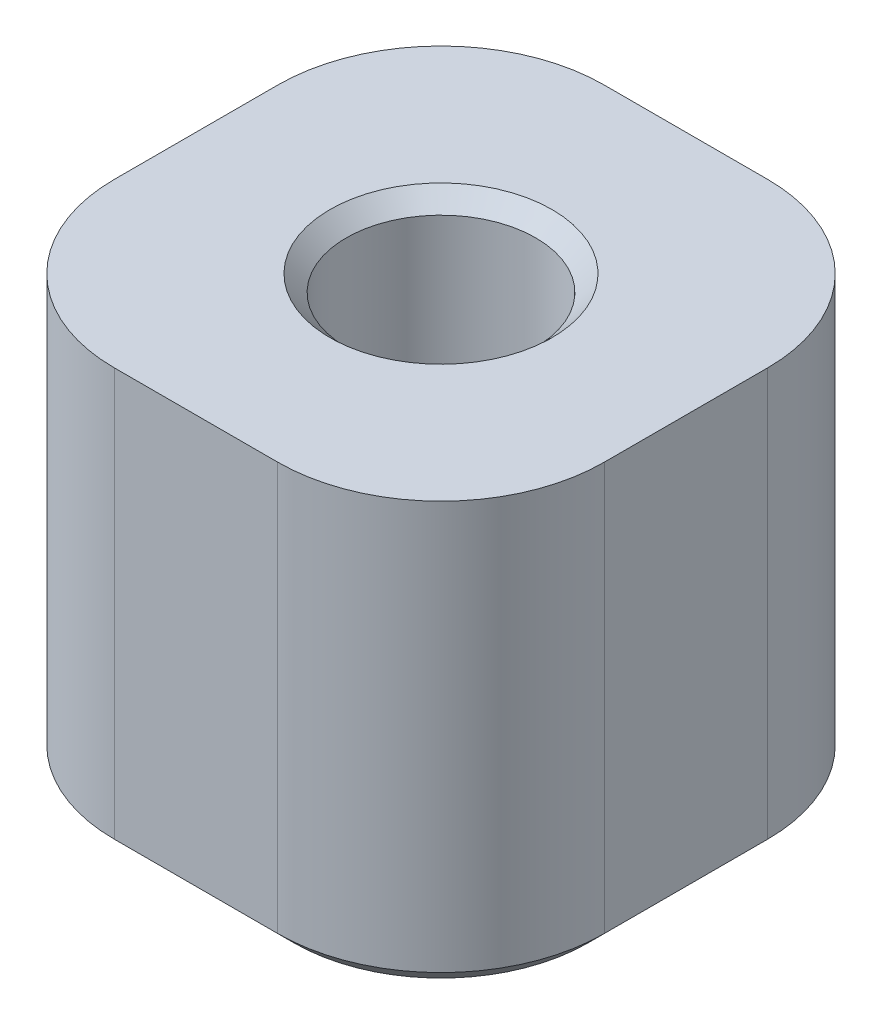
ISO-10303-21;
HEADER;
FILE_DESCRIPTION(('STEP AP214'),'2;1');
FILE_NAME('part.step','',(''),(''),'','','');
FILE_SCHEMA(('AUTOMOTIVE_DESIGN { 1 0 10303 214 1 1 1 1 }'));
ENDSEC;
DATA;
#1=APPLICATION_CONTEXT('core data for automotive mechanical design processes');
#2=APPLICATION_PROTOCOL_DEFINITION('international standard','automotive_design',2000,#1);
#3=PRODUCT_CONTEXT('',#1,'mechanical');
#4=PRODUCT('Part','Part','',(#3));
#5=PRODUCT_RELATED_PRODUCT_CATEGORY('part','',(#4));
#6=PRODUCT_DEFINITION_FORMATION('','',#4);
#7=PRODUCT_DEFINITION_CONTEXT('part definition',#1,'design');
#8=PRODUCT_DEFINITION('design','',#6,#7);
#9=PRODUCT_DEFINITION_SHAPE('','',#8);
#10=(LENGTH_UNIT() NAMED_UNIT(*) SI_UNIT(.MILLI.,.METRE.));
#11=(NAMED_UNIT(*) PLANE_ANGLE_UNIT() SI_UNIT($,.RADIAN.));
#12=(NAMED_UNIT(*) SI_UNIT($,.STERADIAN.) SOLID_ANGLE_UNIT());
#13=UNCERTAINTY_MEASURE_WITH_UNIT(LENGTH_MEASURE(1.E-05),#10,'distance_accuracy_value','');
#14=(GEOMETRIC_REPRESENTATION_CONTEXT(3) GLOBAL_UNCERTAINTY_ASSIGNED_CONTEXT((#13)) GLOBAL_UNIT_ASSIGNED_CONTEXT((#10,
#11,#12)) REPRESENTATION_CONTEXT('',''));
#15=CARTESIAN_POINT('',(0.,0.,0.));
#16=DIRECTION('',(0.,0.,1.));
#17=DIRECTION('',(1.,0.,0.));
#18=AXIS2_PLACEMENT_3D('',#15,#16,#17);
#19=CARTESIAN_POINT('',(15.,26.,15.));
#20=DIRECTION('',(-1.,0.,0.));
#21=DIRECTION('',(0.,0.,1.));
#22=AXIS2_PLACEMENT_3D('',#19,#20,#21);
#23=PLANE('',#22);
#24=DIRECTION('',(0.,-1.,0.));
#25=VECTOR('',#24,1.);
#26=CARTESIAN_POINT('',(15.,26.,5.));
#27=LINE('',#26,#25);
#28=CARTESIAN_POINT('',(15.,26.,5.));
#29=VERTEX_POINT('',#28);
#30=CARTESIAN_POINT('',(15.,1.,5.));
#31=VERTEX_POINT('',#30);
#32=EDGE_CURVE('E143',#29,#31,#27,.T.);
#33=ORIENTED_EDGE('',*,*,#32,.T.);
#34=DIRECTION('',(0.,0.,-1.));
#35=VECTOR('',#34,1.);
#36=CARTESIAN_POINT('',(15.,1.,-5.));
#37=LINE('',#36,#35);
#38=CARTESIAN_POINT('',(15.,1.,-5.));
#39=VERTEX_POINT('',#38);
#40=EDGE_CURVE('E224',#31,#39,#37,.T.);
#41=ORIENTED_EDGE('',*,*,#40,.T.);
#42=DIRECTION('',(0.,-1.,0.));
#43=VECTOR('',#42,1.);
#44=CARTESIAN_POINT('',(15.,26.,-5.));
#45=LINE('',#44,#43);
#46=CARTESIAN_POINT('',(15.,26.,-5.));
#47=VERTEX_POINT('',#46);
#48=EDGE_CURVE('E179',#39,#47,#45,.F.);
#49=ORIENTED_EDGE('',*,*,#48,.T.);
#50=DIRECTION('',(0.,0.,-1.));
#51=VECTOR('',#50,1.);
#52=CARTESIAN_POINT('',(15.,26.,15.));
#53=LINE('',#52,#51);
#54=EDGE_CURVE('E394',#29,#47,#53,.T.);
#55=ORIENTED_EDGE('',*,*,#54,.F.);
#56=EDGE_LOOP('',(#33,#41,#49,#55));
#57=FACE_BOUND('',#56,.T.);
#58=ADVANCED_FACE('F41',(#57),#23,.F.);
#59=CARTESIAN_POINT('',(-15.,26.,-15.));
#60=DIRECTION('',(0.,0.,1.));
#61=DIRECTION('',(1.,0.,0.));
#62=AXIS2_PLACEMENT_3D('',#59,#60,#61);
#63=PLANE('',#62);
#64=DIRECTION('',(0.,-1.,0.));
#65=VECTOR('',#64,1.);
#66=CARTESIAN_POINT('',(5.,26.,-15.));
#67=LINE('',#66,#65);
#68=CARTESIAN_POINT('',(5.,26.,-15.));
#69=VERTEX_POINT('',#68);
#70=CARTESIAN_POINT('',(5.,1.,-15.));
#71=VERTEX_POINT('',#70);
#72=EDGE_CURVE('E157',#69,#71,#67,.T.);
#73=ORIENTED_EDGE('',*,*,#72,.T.);
#74=DIRECTION('',(-1.,0.,0.));
#75=VECTOR('',#74,1.);
#76=CARTESIAN_POINT('',(-5.,1.,-15.));
#77=LINE('',#76,#75);
#78=CARTESIAN_POINT('',(-5.,1.,-15.));
#79=VERTEX_POINT('',#78);
#80=EDGE_CURVE('E66',#71,#79,#77,.T.);
#81=ORIENTED_EDGE('',*,*,#80,.T.);
#82=DIRECTION('',(0.,-1.,0.));
#83=VECTOR('',#82,1.);
#84=CARTESIAN_POINT('',(-5.,26.,-15.));
#85=LINE('',#84,#83);
#86=CARTESIAN_POINT('',(-5.,26.,-15.));
#87=VERTEX_POINT('',#86);
#88=EDGE_CURVE('E161',#79,#87,#85,.F.);
#89=ORIENTED_EDGE('',*,*,#88,.T.);
#90=DIRECTION('',(-1.,0.,0.));
#91=VECTOR('',#90,1.);
#92=CARTESIAN_POINT('',(-15.,26.,-15.));
#93=LINE('',#92,#91);
#94=EDGE_CURVE('E141',#69,#87,#93,.T.);
#95=ORIENTED_EDGE('',*,*,#94,.F.);
#96=EDGE_LOOP('',(#73,#81,#89,#95));
#97=FACE_BOUND('',#96,.T.);
#98=ADVANCED_FACE('F285',(#97),#63,.F.);
#99=CARTESIAN_POINT('',(-15.,26.,15.));
#100=DIRECTION('',(1.,0.,0.));
#101=DIRECTION('',(0.,0.,-1.));
#102=AXIS2_PLACEMENT_3D('',#99,#100,#101);
#103=PLANE('',#102);
#104=DIRECTION('',(0.,-1.,0.));
#105=VECTOR('',#104,1.);
#106=CARTESIAN_POINT('',(-15.,26.,-4.99999999999999));
#107=LINE('',#106,#105);
#108=CARTESIAN_POINT('',(-15.,26.,-4.99999999999999));
#109=VERTEX_POINT('',#108);
#110=CARTESIAN_POINT('',(-15.,1.,-4.99999999999999));
#111=VERTEX_POINT('',#110);
#112=EDGE_CURVE('E148',#109,#111,#107,.T.);
#113=ORIENTED_EDGE('',*,*,#112,.T.);
#114=DIRECTION('',(0.,0.,1.));
#115=VECTOR('',#114,1.);
#116=CARTESIAN_POINT('',(-15.,1.,5.));
#117=LINE('',#116,#115);
#118=CARTESIAN_POINT('',(-15.,1.,5.));
#119=VERTEX_POINT('',#118);
#120=EDGE_CURVE('E234',#111,#119,#117,.T.);
#121=ORIENTED_EDGE('',*,*,#120,.T.);
#122=DIRECTION('',(0.,-1.,0.));
#123=VECTOR('',#122,1.);
#124=CARTESIAN_POINT('',(-15.,26.,5.));
#125=LINE('',#124,#123);
#126=CARTESIAN_POINT('',(-15.,26.,5.));
#127=VERTEX_POINT('',#126);
#128=EDGE_CURVE('E151',#119,#127,#125,.F.);
#129=ORIENTED_EDGE('',*,*,#128,.T.);
#130=DIRECTION('',(0.,0.,1.));
#131=VECTOR('',#130,1.);
#132=CARTESIAN_POINT('',(-15.,26.,15.));
#133=LINE('',#132,#131);
#134=EDGE_CURVE('E138',#109,#127,#133,.T.);
#135=ORIENTED_EDGE('',*,*,#134,.F.);
#136=EDGE_LOOP('',(#113,#121,#129,#135));
#137=FACE_BOUND('',#136,.T.);
#138=ADVANCED_FACE('F147',(#137),#103,.F.);
#139=CARTESIAN_POINT('',(-15.,26.,15.));
#140=DIRECTION('',(0.,0.,-1.));
#141=DIRECTION('',(-1.,0.,0.));
#142=AXIS2_PLACEMENT_3D('',#139,#140,#141);
#143=PLANE('',#142);
#144=DIRECTION('',(0.,-1.,0.));
#145=VECTOR('',#144,1.);
#146=CARTESIAN_POINT('',(-5.,26.,15.));
#147=LINE('',#146,#145);
#148=CARTESIAN_POINT('',(-5.,26.,15.));
#149=VERTEX_POINT('',#148);
#150=CARTESIAN_POINT('',(-5.,1.,15.));
#151=VERTEX_POINT('',#150);
#152=EDGE_CURVE('E185',#149,#151,#147,.T.);
#153=ORIENTED_EDGE('',*,*,#152,.T.);
#154=DIRECTION('',(1.,0.,0.));
#155=VECTOR('',#154,1.);
#156=CARTESIAN_POINT('',(5.,1.,15.));
#157=LINE('',#156,#155);
#158=CARTESIAN_POINT('',(5.,1.,15.));
#159=VERTEX_POINT('',#158);
#160=EDGE_CURVE('E218',#151,#159,#157,.T.);
#161=ORIENTED_EDGE('',*,*,#160,.T.);
#162=DIRECTION('',(0.,-1.,0.));
#163=VECTOR('',#162,1.);
#164=CARTESIAN_POINT('',(5.,26.,15.));
#165=LINE('',#164,#163);
#166=CARTESIAN_POINT('',(5.,26.,15.));
#167=VERTEX_POINT('',#166);
#168=EDGE_CURVE('E182',#159,#167,#165,.F.);
#169=ORIENTED_EDGE('',*,*,#168,.T.);
#170=DIRECTION('',(1.,0.,0.));
#171=VECTOR('',#170,1.);
#172=CARTESIAN_POINT('',(-15.,26.,15.));
#173=LINE('',#172,#171);
#174=EDGE_CURVE('E153',#149,#167,#173,.T.);
#175=ORIENTED_EDGE('',*,*,#174,.F.);
#176=EDGE_LOOP('',(#153,#161,#169,#175));
#177=FACE_BOUND('',#176,.T.);
#178=ADVANCED_FACE('F379',(#177),#143,.F.);
#179=CARTESIAN_POINT('',(0.,26.,0.));
#180=DIRECTION('',(0.,-1.,0.));
#181=DIRECTION('',(0.,0.,-1.));
#182=AXIS2_PLACEMENT_3D('',#179,#180,#181);
#183=PLANE('',#182);
#184=CARTESIAN_POINT('',(0.,26.,0.));
#185=DIRECTION('',(0.,-1.,0.));
#186=DIRECTION('',(0.,0.,-1.));
#187=AXIS2_PLACEMENT_3D('',#184,#185,#186);
#188=CIRCLE('',#187,6.8);
#189=CARTESIAN_POINT('',(0.,26.,-6.8));
#190=VERTEX_POINT('',#189);
#191=EDGE_CURVE('E11',#190,#190,#188,.T.);
#192=ORIENTED_EDGE('',*,*,#191,.T.);
#193=EDGE_LOOP('',(#192));
#194=FACE_BOUND('',#193,.T.);
#195=ORIENTED_EDGE('',*,*,#94,.T.);
#196=CARTESIAN_POINT('',(-5.,26.,-4.99999999999999));
#197=DIRECTION('',(0.,-1.,0.));
#198=DIRECTION('',(0.,0.,-1.));
#199=AXIS2_PLACEMENT_3D('',#196,#197,#198);
#200=CIRCLE('',#199,10.);
#201=EDGE_CURVE('E135',#87,#109,#200,.F.);
#202=ORIENTED_EDGE('',*,*,#201,.T.);
#203=ORIENTED_EDGE('',*,*,#134,.T.);
#204=CARTESIAN_POINT('',(-5.,26.,5.));
#205=DIRECTION('',(0.,-1.,0.));
#206=DIRECTION('',(0.,0.,-1.));
#207=AXIS2_PLACEMENT_3D('',#204,#205,#206);
#208=CIRCLE('',#207,10.);
#209=EDGE_CURVE('E171',#127,#149,#208,.F.);
#210=ORIENTED_EDGE('',*,*,#209,.T.);
#211=ORIENTED_EDGE('',*,*,#174,.T.);
#212=CARTESIAN_POINT('',(5.,26.,5.));
#213=DIRECTION('',(0.,-1.,0.));
#214=DIRECTION('',(0.,0.,-1.));
#215=AXIS2_PLACEMENT_3D('',#212,#213,#214);
#216=CIRCLE('',#215,10.);
#217=EDGE_CURVE('E168',#167,#29,#216,.F.);
#218=ORIENTED_EDGE('',*,*,#217,.T.);
#219=ORIENTED_EDGE('',*,*,#54,.T.);
#220=CARTESIAN_POINT('',(5.,26.,-5.));
#221=DIRECTION('',(0.,-1.,0.));
#222=DIRECTION('',(0.,0.,-1.));
#223=AXIS2_PLACEMENT_3D('',#220,#221,#222);
#224=CIRCLE('',#223,10.);
#225=EDGE_CURVE('E144',#47,#69,#224,.F.);
#226=ORIENTED_EDGE('',*,*,#225,.T.);
#227=EDGE_LOOP('',(#195,#202,#203,#210,#211,#218,#219,#226));
#228=FACE_BOUND('',#227,.T.);
#229=ADVANCED_FACE('F137',(#194,#228),#183,.F.);
#230=CARTESIAN_POINT('',(0.,0.,0.));
#231=DIRECTION('',(0.,-1.,0.));
#232=DIRECTION('',(0.,0.,-1.));
#233=AXIS2_PLACEMENT_3D('',#230,#231,#232);
#234=PLANE('',#233);
#235=DIRECTION('',(-1.,0.,0.));
#236=VECTOR('',#235,1.);
#237=CARTESIAN_POINT('',(-5.,0.,14.));
#238=LINE('',#237,#236);
#239=CARTESIAN_POINT('',(5.,0.,14.));
#240=VERTEX_POINT('',#239);
#241=CARTESIAN_POINT('',(-5.,0.,14.));
#242=VERTEX_POINT('',#241);
#243=EDGE_CURVE('E207',#240,#242,#238,.T.);
#244=ORIENTED_EDGE('',*,*,#243,.T.);
#245=CARTESIAN_POINT('',(-5.,0.,5.));
#246=DIRECTION('',(0.,-1.,0.));
#247=DIRECTION('',(0.,0.,-1.));
#248=AXIS2_PLACEMENT_3D('',#245,#246,#247);
#249=CIRCLE('',#248,9.);
#250=CARTESIAN_POINT('',(-14.,0.,5.));
#251=VERTEX_POINT('',#250);
#252=EDGE_CURVE('E210',#242,#251,#249,.T.);
#253=ORIENTED_EDGE('',*,*,#252,.T.);
#254=DIRECTION('',(0.,0.,-1.));
#255=VECTOR('',#254,1.);
#256=CARTESIAN_POINT('',(-14.,0.,-4.99999999999999));
#257=LINE('',#256,#255);
#258=CARTESIAN_POINT('',(-14.,0.,-4.99999999999999));
#259=VERTEX_POINT('',#258);
#260=EDGE_CURVE('E189',#251,#259,#257,.T.);
#261=ORIENTED_EDGE('',*,*,#260,.T.);
#262=CARTESIAN_POINT('',(-5.,0.,-4.99999999999999));
#263=DIRECTION('',(0.,-1.,0.));
#264=DIRECTION('',(0.,0.,-1.));
#265=AXIS2_PLACEMENT_3D('',#262,#263,#264);
#266=CIRCLE('',#265,9.);
#267=CARTESIAN_POINT('',(-5.,0.,-14.));
#268=VERTEX_POINT('',#267);
#269=EDGE_CURVE('E192',#259,#268,#266,.T.);
#270=ORIENTED_EDGE('',*,*,#269,.T.);
#271=DIRECTION('',(1.,0.,0.));
#272=VECTOR('',#271,1.);
#273=CARTESIAN_POINT('',(5.,0.,-14.));
#274=LINE('',#273,#272);
#275=CARTESIAN_POINT('',(5.,0.,-14.));
#276=VERTEX_POINT('',#275);
#277=EDGE_CURVE('E195',#268,#276,#274,.T.);
#278=ORIENTED_EDGE('',*,*,#277,.T.);
#279=CARTESIAN_POINT('',(5.,0.,-5.));
#280=DIRECTION('',(0.,-1.,0.));
#281=DIRECTION('',(0.,0.,-1.));
#282=AXIS2_PLACEMENT_3D('',#279,#280,#281);
#283=CIRCLE('',#282,9.);
#284=CARTESIAN_POINT('',(14.,0.,-5.));
#285=VERTEX_POINT('',#284);
#286=EDGE_CURVE('E198',#276,#285,#283,.T.);
#287=ORIENTED_EDGE('',*,*,#286,.T.);
#288=DIRECTION('',(0.,0.,1.));
#289=VECTOR('',#288,1.);
#290=CARTESIAN_POINT('',(14.,0.,5.));
#291=LINE('',#290,#289);
#292=CARTESIAN_POINT('',(14.,0.,5.));
#293=VERTEX_POINT('',#292);
#294=EDGE_CURVE('E201',#285,#293,#291,.T.);
#295=ORIENTED_EDGE('',*,*,#294,.T.);
#296=CARTESIAN_POINT('',(5.,0.,5.));
#297=DIRECTION('',(0.,-1.,0.));
#298=DIRECTION('',(0.,0.,-1.));
#299=AXIS2_PLACEMENT_3D('',#296,#297,#298);
#300=CIRCLE('',#299,9.);
#301=EDGE_CURVE('E204',#293,#240,#300,.T.);
#302=ORIENTED_EDGE('',*,*,#301,.T.);
#303=EDGE_LOOP('',(#244,#253,#261,#270,#278,#287,#295,#302));
#304=FACE_BOUND('',#303,.T.);
#305=ADVANCED_FACE('F406',(#304),#234,.T.);
#306=CARTESIAN_POINT('',(0.,6.,0.));
#307=DIRECTION('',(0.,1.,0.));
#308=DIRECTION('',(0.,0.,1.));
#309=AXIS2_PLACEMENT_3D('',#306,#307,#308);
#310=CYLINDRICAL_SURFACE('',#309,5.8);
#311=CARTESIAN_POINT('',(0.,25.,0.));
#312=DIRECTION('',(0.,-1.,0.));
#313=DIRECTION('',(0.,0.,-1.));
#314=AXIS2_PLACEMENT_3D('',#311,#312,#313);
#315=CIRCLE('',#314,5.8);
#316=CARTESIAN_POINT('',(0.,25.,-5.8));
#317=VERTEX_POINT('',#316);
#318=EDGE_CURVE('E51',#317,#317,#315,.F.);
#319=ORIENTED_EDGE('',*,*,#318,.T.);
#320=EDGE_LOOP('',(#319));
#321=FACE_BOUND('',#320,.T.);
#322=CARTESIAN_POINT('',(0.,6.,0.));
#323=DIRECTION('',(0.,1.,0.));
#324=DIRECTION('',(0.,0.,1.));
#325=AXIS2_PLACEMENT_3D('',#322,#323,#324);
#326=CIRCLE('',#325,5.8);
#327=CARTESIAN_POINT('',(0.,6.,5.8));
#328=VERTEX_POINT('',#327);
#329=EDGE_CURVE('E266',#328,#328,#326,.T.);
#330=ORIENTED_EDGE('',*,*,#329,.F.);
#331=EDGE_LOOP('',(#330));
#332=FACE_BOUND('',#331,.T.);
#333=ADVANCED_FACE('F271',(#321,#332),#310,.F.);
#334=CARTESIAN_POINT('',(0.,6.,0.));
#335=DIRECTION('',(0.,1.,0.));
#336=DIRECTION('',(0.,0.,1.));
#337=AXIS2_PLACEMENT_3D('',#334,#335,#336);
#338=PLANE('',#337);
#339=ORIENTED_EDGE('',*,*,#329,.T.);
#340=EDGE_LOOP('',(#339));
#341=FACE_BOUND('',#340,.T.);
#342=ADVANCED_FACE('F297',(#341),#338,.T.);
#343=CARTESIAN_POINT('',(-5.,26.,-4.99999999999999));
#344=DIRECTION('',(0.,-1.,0.));
#345=DIRECTION('',(0.,0.,-1.));
#346=AXIS2_PLACEMENT_3D('',#343,#344,#345);
#347=CYLINDRICAL_SURFACE('',#346,10.);
#348=ORIENTED_EDGE('',*,*,#88,.F.);
#349=CARTESIAN_POINT('',(-5.,1.,-4.99999999999999));
#350=DIRECTION('',(0.,-1.,0.));
#351=DIRECTION('',(0.,0.,-1.));
#352=AXIS2_PLACEMENT_3D('',#349,#350,#351);
#353=CIRCLE('',#352,10.);
#354=EDGE_CURVE('E58',#79,#111,#353,.F.);
#355=ORIENTED_EDGE('',*,*,#354,.T.);
#356=ORIENTED_EDGE('',*,*,#112,.F.);
#357=ORIENTED_EDGE('',*,*,#201,.F.);
#358=EDGE_LOOP('',(#348,#355,#356,#357));
#359=FACE_BOUND('',#358,.T.);
#360=ADVANCED_FACE('F155',(#359),#347,.T.);
#361=CARTESIAN_POINT('',(5.,26.,-5.));
#362=DIRECTION('',(0.,-1.,0.));
#363=DIRECTION('',(0.,0.,-1.));
#364=AXIS2_PLACEMENT_3D('',#361,#362,#363);
#365=CYLINDRICAL_SURFACE('',#364,10.);
#366=ORIENTED_EDGE('',*,*,#48,.F.);
#367=CARTESIAN_POINT('',(5.,1.,-5.));
#368=DIRECTION('',(0.,-1.,0.));
#369=DIRECTION('',(0.,0.,-1.));
#370=AXIS2_PLACEMENT_3D('',#367,#368,#369);
#371=CIRCLE('',#370,10.);
#372=EDGE_CURVE('E227',#39,#71,#371,.F.);
#373=ORIENTED_EDGE('',*,*,#372,.T.);
#374=ORIENTED_EDGE('',*,*,#72,.F.);
#375=ORIENTED_EDGE('',*,*,#225,.F.);
#376=EDGE_LOOP('',(#366,#373,#374,#375));
#377=FACE_BOUND('',#376,.T.);
#378=ADVANCED_FACE('F296',(#377),#365,.T.);
#379=CARTESIAN_POINT('',(-5.,26.,5.));
#380=DIRECTION('',(0.,-1.,0.));
#381=DIRECTION('',(0.,0.,-1.));
#382=AXIS2_PLACEMENT_3D('',#379,#380,#381);
#383=CYLINDRICAL_SURFACE('',#382,10.);
#384=ORIENTED_EDGE('',*,*,#128,.F.);
#385=CARTESIAN_POINT('',(-5.,1.,5.));
#386=DIRECTION('',(0.,-1.,0.));
#387=DIRECTION('',(0.,0.,-1.));
#388=AXIS2_PLACEMENT_3D('',#385,#386,#387);
#389=CIRCLE('',#388,10.);
#390=EDGE_CURVE('E214',#119,#151,#389,.F.);
#391=ORIENTED_EDGE('',*,*,#390,.T.);
#392=ORIENTED_EDGE('',*,*,#152,.F.);
#393=ORIENTED_EDGE('',*,*,#209,.F.);
#394=EDGE_LOOP('',(#384,#391,#392,#393));
#395=FACE_BOUND('',#394,.T.);
#396=ADVANCED_FACE('F300',(#395),#383,.T.);
#397=CARTESIAN_POINT('',(5.,26.,5.));
#398=DIRECTION('',(0.,-1.,0.));
#399=DIRECTION('',(0.,0.,-1.));
#400=AXIS2_PLACEMENT_3D('',#397,#398,#399);
#401=CYLINDRICAL_SURFACE('',#400,10.);
#402=ORIENTED_EDGE('',*,*,#168,.F.);
#403=CARTESIAN_POINT('',(5.,1.,5.));
#404=DIRECTION('',(0.,-1.,0.));
#405=DIRECTION('',(0.,0.,-1.));
#406=AXIS2_PLACEMENT_3D('',#403,#404,#405);
#407=CIRCLE('',#406,10.);
#408=EDGE_CURVE('E221',#159,#31,#407,.F.);
#409=ORIENTED_EDGE('',*,*,#408,.T.);
#410=ORIENTED_EDGE('',*,*,#32,.F.);
#411=ORIENTED_EDGE('',*,*,#217,.F.);
#412=EDGE_LOOP('',(#402,#409,#410,#411));
#413=FACE_BOUND('',#412,.T.);
#414=ADVANCED_FACE('F304',(#413),#401,.T.);
#415=CARTESIAN_POINT('',(5.,0.,-5.));
#416=DIRECTION('',(0.,1.,0.));
#417=DIRECTION('',(0.,0.,1.));
#418=AXIS2_PLACEMENT_3D('',#415,#416,#417);
#419=CONICAL_SURFACE('',#418,9.,0.785398163397449);
#420=DIRECTION('',(0.,-0.707106781186547,0.707106781186547));
#421=VECTOR('',#420,1.);
#422=CARTESIAN_POINT('',(5.,1.,-15.));
#423=LINE('',#422,#421);
#424=EDGE_CURVE('E259',#71,#276,#423,.T.);
#425=ORIENTED_EDGE('',*,*,#424,.F.);
#426=ORIENTED_EDGE('',*,*,#372,.F.);
#427=DIRECTION('',(0.707106781186548,0.707106781186547,0.));
#428=VECTOR('',#427,1.);
#429=CARTESIAN_POINT('',(14.,0.,-5.));
#430=LINE('',#429,#428);
#431=EDGE_CURVE('E263',#285,#39,#430,.T.);
#432=ORIENTED_EDGE('',*,*,#431,.F.);
#433=ORIENTED_EDGE('',*,*,#286,.F.);
#434=EDGE_LOOP('',(#425,#426,#432,#433));
#435=FACE_BOUND('',#434,.T.);
#436=ADVANCED_FACE('F307',(#435),#419,.T.);
#437=CARTESIAN_POINT('',(15.,1.,15.));
#438=DIRECTION('',(0.707106781186548,-0.707106781186547,0.));
#439=DIRECTION('',(0.,0.,1.));
#440=AXIS2_PLACEMENT_3D('',#437,#438,#439);
#441=PLANE('',#440);
#442=ORIENTED_EDGE('',*,*,#431,.T.);
#443=ORIENTED_EDGE('',*,*,#40,.F.);
#444=DIRECTION('',(0.707106781186547,0.707106781186547,0.));
#445=VECTOR('',#444,1.);
#446=CARTESIAN_POINT('',(14.,0.,5.));
#447=LINE('',#446,#445);
#448=EDGE_CURVE('E255',#293,#31,#447,.T.);
#449=ORIENTED_EDGE('',*,*,#448,.F.);
#450=ORIENTED_EDGE('',*,*,#294,.F.);
#451=EDGE_LOOP('',(#442,#443,#449,#450));
#452=FACE_BOUND('',#451,.T.);
#453=ADVANCED_FACE('F347',(#452),#441,.T.);
#454=CARTESIAN_POINT('',(-15.,1.,-15.));
#455=DIRECTION('',(0.,-0.707106781186547,-0.707106781186548));
#456=DIRECTION('',(1.,0.,0.));
#457=AXIS2_PLACEMENT_3D('',#454,#455,#456);
#458=PLANE('',#457);
#459=ORIENTED_EDGE('',*,*,#424,.T.);
#460=ORIENTED_EDGE('',*,*,#277,.F.);
#461=DIRECTION('',(0.,-0.707106781186547,0.707106781186547));
#462=VECTOR('',#461,1.);
#463=CARTESIAN_POINT('',(-5.,1.,-15.));
#464=LINE('',#463,#462);
#465=EDGE_CURVE('E251',#79,#268,#464,.T.);
#466=ORIENTED_EDGE('',*,*,#465,.F.);
#467=ORIENTED_EDGE('',*,*,#80,.F.);
#468=EDGE_LOOP('',(#459,#460,#466,#467));
#469=FACE_BOUND('',#468,.T.);
#470=ADVANCED_FACE('F340',(#469),#458,.T.);
#471=CARTESIAN_POINT('',(5.,0.,5.));
#472=DIRECTION('',(0.,1.,0.));
#473=DIRECTION('',(0.,0.,1.));
#474=AXIS2_PLACEMENT_3D('',#471,#472,#473);
#475=CONICAL_SURFACE('',#474,9.,0.785398163397449);
#476=ORIENTED_EDGE('',*,*,#448,.T.);
#477=ORIENTED_EDGE('',*,*,#408,.F.);
#478=DIRECTION('',(0.,0.707106781186547,0.707106781186548));
#479=VECTOR('',#478,1.);
#480=CARTESIAN_POINT('',(5.,0.,14.));
#481=LINE('',#480,#479);
#482=EDGE_CURVE('E247',#240,#159,#481,.T.);
#483=ORIENTED_EDGE('',*,*,#482,.F.);
#484=ORIENTED_EDGE('',*,*,#301,.F.);
#485=EDGE_LOOP('',(#476,#477,#483,#484));
#486=FACE_BOUND('',#485,.T.);
#487=ADVANCED_FACE('F333',(#486),#475,.T.);
#488=CARTESIAN_POINT('',(-5.,0.,-4.99999999999999));
#489=DIRECTION('',(0.,1.,0.));
#490=DIRECTION('',(0.,0.,1.));
#491=AXIS2_PLACEMENT_3D('',#488,#489,#490);
#492=CONICAL_SURFACE('',#491,9.,0.785398163397448);
#493=ORIENTED_EDGE('',*,*,#465,.T.);
#494=ORIENTED_EDGE('',*,*,#269,.F.);
#495=DIRECTION('',(0.707106781186547,-0.707106781186547,0.));
#496=VECTOR('',#495,1.);
#497=CARTESIAN_POINT('',(-15.,1.,-4.99999999999999));
#498=LINE('',#497,#496);
#499=EDGE_CURVE('E243',#111,#259,#498,.T.);
#500=ORIENTED_EDGE('',*,*,#499,.F.);
#501=ORIENTED_EDGE('',*,*,#354,.F.);
#502=EDGE_LOOP('',(#493,#494,#500,#501));
#503=FACE_BOUND('',#502,.T.);
#504=ADVANCED_FACE('F326',(#503),#492,.T.);
#505=CARTESIAN_POINT('',(-15.,1.,15.));
#506=DIRECTION('',(0.,-0.707106781186547,0.707106781186547));
#507=DIRECTION('',(-1.,0.,0.));
#508=AXIS2_PLACEMENT_3D('',#505,#506,#507);
#509=PLANE('',#508);
#510=ORIENTED_EDGE('',*,*,#482,.T.);
#511=ORIENTED_EDGE('',*,*,#160,.F.);
#512=DIRECTION('',(0.,0.707106781186547,0.707106781186547));
#513=VECTOR('',#512,1.);
#514=CARTESIAN_POINT('',(-5.,0.,14.));
#515=LINE('',#514,#513);
#516=EDGE_CURVE('E240',#242,#151,#515,.T.);
#517=ORIENTED_EDGE('',*,*,#516,.F.);
#518=ORIENTED_EDGE('',*,*,#243,.F.);
#519=EDGE_LOOP('',(#510,#511,#517,#518));
#520=FACE_BOUND('',#519,.T.);
#521=ADVANCED_FACE('F319',(#520),#509,.T.);
#522=CARTESIAN_POINT('',(-15.,1.,15.));
#523=DIRECTION('',(-0.707106781186548,-0.707106781186547,0.));
#524=DIRECTION('',(0.,0.,-1.));
#525=AXIS2_PLACEMENT_3D('',#522,#523,#524);
#526=PLANE('',#525);
#527=ORIENTED_EDGE('',*,*,#499,.T.);
#528=ORIENTED_EDGE('',*,*,#260,.F.);
#529=DIRECTION('',(0.707106781186547,-0.707106781186547,0.));
#530=VECTOR('',#529,1.);
#531=CARTESIAN_POINT('',(-15.,1.,5.));
#532=LINE('',#531,#530);
#533=EDGE_CURVE('E237',#119,#251,#532,.T.);
#534=ORIENTED_EDGE('',*,*,#533,.F.);
#535=ORIENTED_EDGE('',*,*,#120,.F.);
#536=EDGE_LOOP('',(#527,#528,#534,#535));
#537=FACE_BOUND('',#536,.T.);
#538=ADVANCED_FACE('F280',(#537),#526,.T.);
#539=CARTESIAN_POINT('',(-5.,0.,5.));
#540=DIRECTION('',(0.,1.,0.));
#541=DIRECTION('',(0.,0.,1.));
#542=AXIS2_PLACEMENT_3D('',#539,#540,#541);
#543=CONICAL_SURFACE('',#542,9.,0.785398163397449);
#544=ORIENTED_EDGE('',*,*,#516,.T.);
#545=ORIENTED_EDGE('',*,*,#390,.F.);
#546=ORIENTED_EDGE('',*,*,#533,.T.);
#547=ORIENTED_EDGE('',*,*,#252,.F.);
#548=EDGE_LOOP('',(#544,#545,#546,#547));
#549=FACE_BOUND('',#548,.T.);
#550=ADVANCED_FACE('F275',(#549),#543,.T.);
#551=CARTESIAN_POINT('',(0.,25.,0.));
#552=DIRECTION('',(0.,1.,0.));
#553=DIRECTION('',(0.,0.,1.));
#554=AXIS2_PLACEMENT_3D('',#551,#552,#553);
#555=CONICAL_SURFACE('',#554,5.8,0.785398163397448);
#556=ORIENTED_EDGE('',*,*,#191,.F.);
#557=EDGE_LOOP('',(#556));
#558=FACE_BOUND('',#557,.T.);
#559=ORIENTED_EDGE('',*,*,#318,.F.);
#560=EDGE_LOOP('',(#559));
#561=FACE_BOUND('',#560,.T.);
#562=ADVANCED_FACE('F44',(#558,#561),#555,.F.);
#563=CLOSED_SHELL('',(#58,#98,#138,#178,#229,#305,#333,#342,#360,#378,#396,#414,#436,#453,#470,
#487,#504,#521,#538,#550,#562));
#564=MANIFOLD_SOLID_BREP('B2',#563);
#565=ADVANCED_BREP_SHAPE_REPRESENTATION('',(#18,#564),#14);
#566=SHAPE_DEFINITION_REPRESENTATION(#9,#565);
ENDSEC;
END-ISO-10303-21;
